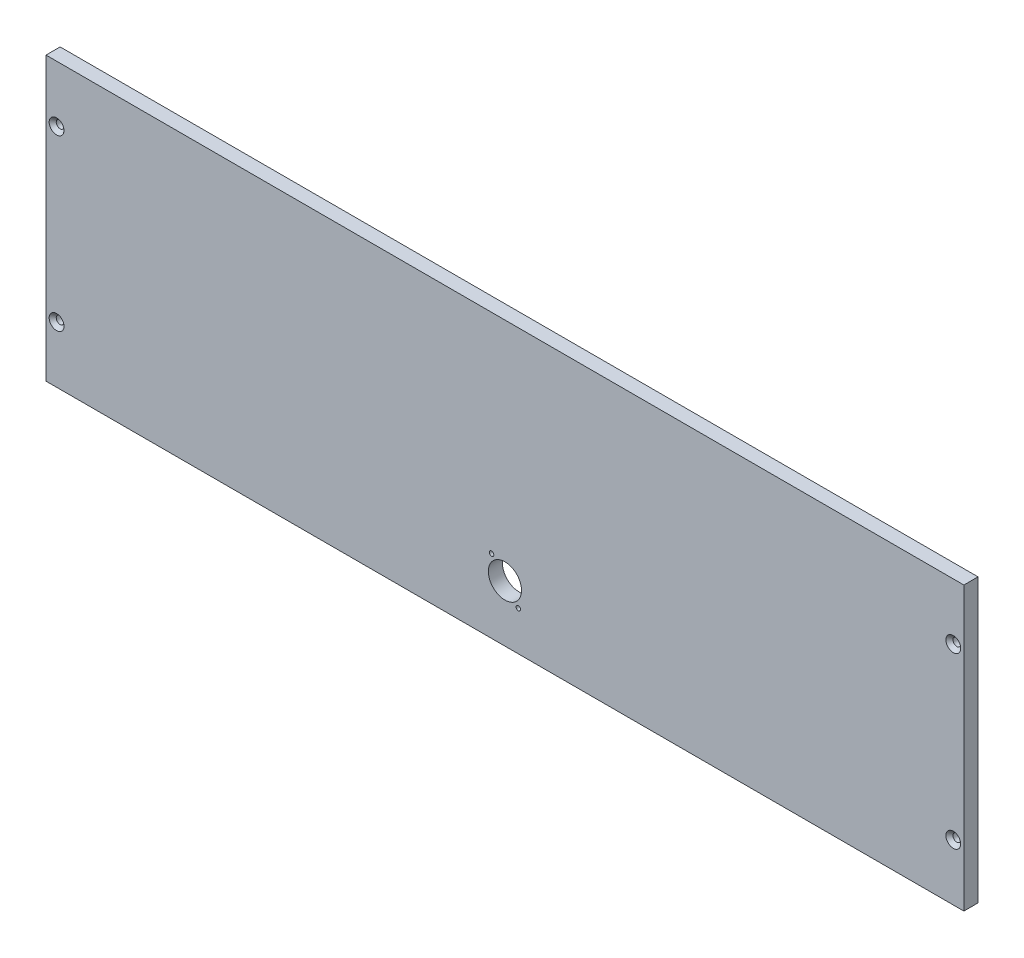
ISO-10303-21;
HEADER;
FILE_DESCRIPTION(('STEP AP214'),'2;1');
FILE_NAME('part.step','',(''),(''),'','','');
FILE_SCHEMA(('AUTOMOTIVE_DESIGN { 1 0 10303 214 1 1 1 1 }'));
ENDSEC;
DATA;
#1=APPLICATION_CONTEXT('core data for automotive mechanical design processes');
#2=APPLICATION_PROTOCOL_DEFINITION('international standard','automotive_design',2000,#1);
#3=PRODUCT_CONTEXT('',#1,'mechanical');
#4=PRODUCT('Part','Part','',(#3));
#5=PRODUCT_RELATED_PRODUCT_CATEGORY('part','',(#4));
#6=PRODUCT_DEFINITION_FORMATION('','',#4);
#7=PRODUCT_DEFINITION_CONTEXT('part definition',#1,'design');
#8=PRODUCT_DEFINITION('design','',#6,#7);
#9=PRODUCT_DEFINITION_SHAPE('','',#8);
#10=(LENGTH_UNIT() NAMED_UNIT(*) SI_UNIT(.MILLI.,.METRE.));
#11=(NAMED_UNIT(*) PLANE_ANGLE_UNIT() SI_UNIT($,.RADIAN.));
#12=(NAMED_UNIT(*) SI_UNIT($,.STERADIAN.) SOLID_ANGLE_UNIT());
#13=UNCERTAINTY_MEASURE_WITH_UNIT(LENGTH_MEASURE(1.E-05),#10,'distance_accuracy_value','');
#14=(GEOMETRIC_REPRESENTATION_CONTEXT(3) GLOBAL_UNCERTAINTY_ASSIGNED_CONTEXT((#13)) GLOBAL_UNIT_ASSIGNED_CONTEXT((#10,
#11,#12)) REPRESENTATION_CONTEXT('',''));
#15=CARTESIAN_POINT('',(0.,0.,0.));
#16=DIRECTION('',(0.,0.,1.));
#17=DIRECTION('',(1.,0.,0.));
#18=AXIS2_PLACEMENT_3D('',#15,#16,#17);
#19=CARTESIAN_POINT('',(0.,0.,10.));
#20=DIRECTION('',(1.,0.,0.));
#21=DIRECTION('',(0.,0.,-1.));
#22=AXIS2_PLACEMENT_3D('',#19,#20,#21);
#23=PLANE('',#22);
#24=DIRECTION('',(0.,-1.,0.));
#25=VECTOR('',#24,1.);
#26=CARTESIAN_POINT('',(0.,0.,0.));
#27=LINE('',#26,#25);
#28=CARTESIAN_POINT('',(0.,200.,0.));
#29=VERTEX_POINT('',#28);
#30=CARTESIAN_POINT('',(0.,0.,0.));
#31=VERTEX_POINT('',#30);
#32=EDGE_CURVE('E114',#29,#31,#27,.T.);
#33=ORIENTED_EDGE('',*,*,#32,.T.);
#34=DIRECTION('',(0.,0.,-1.));
#35=VECTOR('',#34,1.);
#36=CARTESIAN_POINT('',(0.,0.,10.));
#37=LINE('',#36,#35);
#38=CARTESIAN_POINT('',(0.,0.,10.));
#39=VERTEX_POINT('',#38);
#40=EDGE_CURVE('E105',#39,#31,#37,.T.);
#41=ORIENTED_EDGE('',*,*,#40,.F.);
#42=DIRECTION('',(0.,-1.,0.));
#43=VECTOR('',#42,1.);
#44=CARTESIAN_POINT('',(0.,0.,10.));
#45=LINE('',#44,#43);
#46=CARTESIAN_POINT('',(0.,200.,10.));
#47=VERTEX_POINT('',#46);
#48=EDGE_CURVE('E99',#47,#39,#45,.T.);
#49=ORIENTED_EDGE('',*,*,#48,.F.);
#50=DIRECTION('',(0.,0.,-1.));
#51=VECTOR('',#50,1.);
#52=CARTESIAN_POINT('',(0.,200.,10.));
#53=LINE('',#52,#51);
#54=EDGE_CURVE('E110',#47,#29,#53,.T.);
#55=ORIENTED_EDGE('',*,*,#54,.T.);
#56=EDGE_LOOP('',(#33,#41,#49,#55));
#57=FACE_BOUND('',#56,.T.);
#58=ADVANCED_FACE('F46',(#57),#23,.F.);
#59=CARTESIAN_POINT('',(0.,0.,10.));
#60=DIRECTION('',(0.,1.,0.));
#61=DIRECTION('',(0.,0.,1.));
#62=AXIS2_PLACEMENT_3D('',#59,#60,#61);
#63=PLANE('',#62);
#64=DIRECTION('',(1.,0.,0.));
#65=VECTOR('',#64,1.);
#66=CARTESIAN_POINT('',(0.,0.,0.));
#67=LINE('',#66,#65);
#68=CARTESIAN_POINT('',(650.,0.,0.));
#69=VERTEX_POINT('',#68);
#70=EDGE_CURVE('E104',#31,#69,#67,.T.);
#71=ORIENTED_EDGE('',*,*,#70,.T.);
#72=DIRECTION('',(0.,0.,-1.));
#73=VECTOR('',#72,1.);
#74=CARTESIAN_POINT('',(650.,0.,10.));
#75=LINE('',#74,#73);
#76=CARTESIAN_POINT('',(650.,0.,10.));
#77=VERTEX_POINT('',#76);
#78=EDGE_CURVE('E102',#77,#69,#75,.T.);
#79=ORIENTED_EDGE('',*,*,#78,.F.);
#80=DIRECTION('',(1.,0.,0.));
#81=VECTOR('',#80,1.);
#82=CARTESIAN_POINT('',(0.,0.,10.));
#83=LINE('',#82,#81);
#84=EDGE_CURVE('E94',#39,#77,#83,.T.);
#85=ORIENTED_EDGE('',*,*,#84,.F.);
#86=ORIENTED_EDGE('',*,*,#40,.T.);
#87=EDGE_LOOP('',(#71,#79,#85,#86));
#88=FACE_BOUND('',#87,.T.);
#89=ADVANCED_FACE('F103',(#88),#63,.F.);
#90=CARTESIAN_POINT('',(650.,0.,10.));
#91=DIRECTION('',(-1.,0.,0.));
#92=DIRECTION('',(0.,0.,1.));
#93=AXIS2_PLACEMENT_3D('',#90,#91,#92);
#94=PLANE('',#93);
#95=DIRECTION('',(0.,1.,0.));
#96=VECTOR('',#95,1.);
#97=CARTESIAN_POINT('',(650.,0.,0.));
#98=LINE('',#97,#96);
#99=CARTESIAN_POINT('',(650.,200.,0.));
#100=VERTEX_POINT('',#99);
#101=EDGE_CURVE('E80',#69,#100,#98,.T.);
#102=ORIENTED_EDGE('',*,*,#101,.T.);
#103=DIRECTION('',(0.,0.,-1.));
#104=VECTOR('',#103,1.);
#105=CARTESIAN_POINT('',(650.,200.,10.));
#106=LINE('',#105,#104);
#107=CARTESIAN_POINT('',(650.,200.,10.));
#108=VERTEX_POINT('',#107);
#109=EDGE_CURVE('E106',#108,#100,#106,.T.);
#110=ORIENTED_EDGE('',*,*,#109,.F.);
#111=DIRECTION('',(0.,1.,0.));
#112=VECTOR('',#111,1.);
#113=CARTESIAN_POINT('',(650.,0.,10.));
#114=LINE('',#113,#112);
#115=EDGE_CURVE('E97',#77,#108,#114,.T.);
#116=ORIENTED_EDGE('',*,*,#115,.F.);
#117=ORIENTED_EDGE('',*,*,#78,.T.);
#118=EDGE_LOOP('',(#102,#110,#116,#117));
#119=FACE_BOUND('',#118,.T.);
#120=ADVANCED_FACE('F108',(#119),#94,.F.);
#121=CARTESIAN_POINT('',(0.,200.,10.));
#122=DIRECTION('',(0.,-1.,0.));
#123=DIRECTION('',(0.,0.,-1.));
#124=AXIS2_PLACEMENT_3D('',#121,#122,#123);
#125=PLANE('',#124);
#126=DIRECTION('',(-1.,0.,0.));
#127=VECTOR('',#126,1.);
#128=CARTESIAN_POINT('',(0.,200.,0.));
#129=LINE('',#128,#127);
#130=EDGE_CURVE('E86',#100,#29,#129,.T.);
#131=ORIENTED_EDGE('',*,*,#130,.T.);
#132=ORIENTED_EDGE('',*,*,#54,.F.);
#133=DIRECTION('',(-1.,0.,0.));
#134=VECTOR('',#133,1.);
#135=CARTESIAN_POINT('',(0.,200.,10.));
#136=LINE('',#135,#134);
#137=EDGE_CURVE('E63',#108,#47,#136,.T.);
#138=ORIENTED_EDGE('',*,*,#137,.F.);
#139=ORIENTED_EDGE('',*,*,#109,.T.);
#140=EDGE_LOOP('',(#131,#132,#138,#139));
#141=FACE_BOUND('',#140,.T.);
#142=ADVANCED_FACE('F232',(#141),#125,.F.);
#143=CARTESIAN_POINT('',(0.,0.,10.));
#144=DIRECTION('',(0.,0.,-1.));
#145=DIRECTION('',(-1.,0.,0.));
#146=AXIS2_PLACEMENT_3D('',#143,#144,#145);
#147=PLANE('',#146);
#148=CARTESIAN_POINT('',(315.499614793712,51.9994043990588,10.));
#149=DIRECTION('',(0.,0.,1.));
#150=DIRECTION('',(1.,0.,0.));
#151=AXIS2_PLACEMENT_3D('',#148,#149,#150);
#152=CIRCLE('',#151,1.59999999999995);
#153=CARTESIAN_POINT('',(317.099614793712,51.9994043990588,10.));
#154=VERTEX_POINT('',#153);
#155=EDGE_CURVE('E215',#154,#154,#152,.T.);
#156=ORIENTED_EDGE('',*,*,#155,.F.);
#157=EDGE_LOOP('',(#156));
#158=FACE_BOUND('',#157,.T.);
#159=CARTESIAN_POINT('',(334.500385206288,28.0005956009415,10.));
#160=DIRECTION('',(0.,0.,1.));
#161=DIRECTION('',(1.,0.,0.));
#162=AXIS2_PLACEMENT_3D('',#159,#160,#161);
#163=CIRCLE('',#162,1.59999999999977);
#164=CARTESIAN_POINT('',(336.100385206288,28.0005956009415,10.));
#165=VERTEX_POINT('',#164);
#166=EDGE_CURVE('E209',#165,#165,#163,.T.);
#167=ORIENTED_EDGE('',*,*,#166,.F.);
#168=EDGE_LOOP('',(#167));
#169=FACE_BOUND('',#168,.T.);
#170=CARTESIAN_POINT('',(325.,40.,10.));
#171=DIRECTION('',(0.,0.,1.));
#172=DIRECTION('',(1.,0.,0.));
#173=AXIS2_PLACEMENT_3D('',#170,#171,#172);
#174=CIRCLE('',#173,11.75);
#175=CARTESIAN_POINT('',(336.75,40.,10.));
#176=VERTEX_POINT('',#175);
#177=EDGE_CURVE('E203',#176,#176,#174,.T.);
#178=ORIENTED_EDGE('',*,*,#177,.F.);
#179=EDGE_LOOP('',(#178));
#180=FACE_BOUND('',#179,.T.);
#181=CARTESIAN_POINT('',(7.5,160.,10.));
#182=DIRECTION('',(0.,0.,-1.));
#183=DIRECTION('',(-1.,0.,0.));
#184=AXIS2_PLACEMENT_3D('',#181,#182,#183);
#185=CIRCLE('',#184,5.25000000000003);
#186=CARTESIAN_POINT('',(2.24999999999997,160.,10.));
#187=VERTEX_POINT('',#186);
#188=EDGE_CURVE('E136',#187,#187,#185,.T.);
#189=ORIENTED_EDGE('',*,*,#188,.T.);
#190=EDGE_LOOP('',(#189));
#191=FACE_BOUND('',#190,.T.);
#192=CARTESIAN_POINT('',(7.5,40.,10.));
#193=DIRECTION('',(0.,0.,-1.));
#194=DIRECTION('',(-1.,0.,0.));
#195=AXIS2_PLACEMENT_3D('',#192,#193,#194);
#196=CIRCLE('',#195,5.25000000000003);
#197=CARTESIAN_POINT('',(2.24999999999997,40.,10.));
#198=VERTEX_POINT('',#197);
#199=EDGE_CURVE('E133',#198,#198,#196,.T.);
#200=ORIENTED_EDGE('',*,*,#199,.T.);
#201=EDGE_LOOP('',(#200));
#202=FACE_BOUND('',#201,.T.);
#203=CARTESIAN_POINT('',(642.5,40.,10.));
#204=DIRECTION('',(0.,0.,-1.));
#205=DIRECTION('',(-1.,0.,0.));
#206=AXIS2_PLACEMENT_3D('',#203,#204,#205);
#207=CIRCLE('',#206,5.24999999999998);
#208=CARTESIAN_POINT('',(647.75,40.,10.));
#209=VERTEX_POINT('',#208);
#210=EDGE_CURVE('E130',#209,#209,#207,.T.);
#211=ORIENTED_EDGE('',*,*,#210,.T.);
#212=EDGE_LOOP('',(#211));
#213=FACE_BOUND('',#212,.T.);
#214=CARTESIAN_POINT('',(642.5,160.,10.));
#215=DIRECTION('',(0.,0.,-1.));
#216=DIRECTION('',(-1.,0.,0.));
#217=AXIS2_PLACEMENT_3D('',#214,#215,#216);
#218=CIRCLE('',#217,5.24999999999998);
#219=CARTESIAN_POINT('',(637.25,160.,10.));
#220=VERTEX_POINT('',#219);
#221=EDGE_CURVE('E127',#220,#220,#218,.T.);
#222=ORIENTED_EDGE('',*,*,#221,.T.);
#223=EDGE_LOOP('',(#222));
#224=FACE_BOUND('',#223,.T.);
#225=ORIENTED_EDGE('',*,*,#48,.T.);
#226=ORIENTED_EDGE('',*,*,#84,.T.);
#227=ORIENTED_EDGE('',*,*,#115,.T.);
#228=ORIENTED_EDGE('',*,*,#137,.T.);
#229=EDGE_LOOP('',(#225,#226,#227,#228));
#230=FACE_BOUND('',#229,.T.);
#231=ADVANCED_FACE('F95',(#158,#169,#180,#191,#202,#213,#224,#230),#147,.F.);
#232=CARTESIAN_POINT('',(0.,0.,0.));
#233=DIRECTION('',(0.,0.,-1.));
#234=DIRECTION('',(-1.,0.,0.));
#235=AXIS2_PLACEMENT_3D('',#232,#233,#234);
#236=PLANE('',#235);
#237=CARTESIAN_POINT('',(315.499614793712,51.9994043990588,0.));
#238=DIRECTION('',(0.,0.,1.));
#239=DIRECTION('',(1.,0.,0.));
#240=AXIS2_PLACEMENT_3D('',#237,#238,#239);
#241=CIRCLE('',#240,1.59999999999995);
#242=CARTESIAN_POINT('',(317.099614793712,51.9994043990588,0.));
#243=VERTEX_POINT('',#242);
#244=EDGE_CURVE('E206',#243,#243,#241,.T.);
#245=ORIENTED_EDGE('',*,*,#244,.T.);
#246=EDGE_LOOP('',(#245));
#247=FACE_BOUND('',#246,.T.);
#248=CARTESIAN_POINT('',(334.500385206288,28.0005956009415,0.));
#249=DIRECTION('',(0.,0.,1.));
#250=DIRECTION('',(1.,0.,0.));
#251=AXIS2_PLACEMENT_3D('',#248,#249,#250);
#252=CIRCLE('',#251,1.59999999999977);
#253=CARTESIAN_POINT('',(336.100385206288,28.0005956009415,0.));
#254=VERTEX_POINT('',#253);
#255=EDGE_CURVE('E212',#254,#254,#252,.T.);
#256=ORIENTED_EDGE('',*,*,#255,.T.);
#257=EDGE_LOOP('',(#256));
#258=FACE_BOUND('',#257,.T.);
#259=CARTESIAN_POINT('',(325.,40.,0.));
#260=DIRECTION('',(0.,0.,1.));
#261=DIRECTION('',(1.,0.,0.));
#262=AXIS2_PLACEMENT_3D('',#259,#260,#261);
#263=CIRCLE('',#262,11.75);
#264=CARTESIAN_POINT('',(336.75,40.,0.));
#265=VERTEX_POINT('',#264);
#266=EDGE_CURVE('E200',#265,#265,#263,.T.);
#267=ORIENTED_EDGE('',*,*,#266,.T.);
#268=EDGE_LOOP('',(#267));
#269=FACE_BOUND('',#268,.T.);
#270=CARTESIAN_POINT('',(642.5,160.,0.));
#271=DIRECTION('',(0.,0.,1.));
#272=DIRECTION('',(1.,0.,0.));
#273=AXIS2_PLACEMENT_3D('',#270,#271,#272);
#274=CIRCLE('',#273,2.75000000000004);
#275=CARTESIAN_POINT('',(645.25,160.,0.));
#276=VERTEX_POINT('',#275);
#277=EDGE_CURVE('E191',#276,#276,#274,.T.);
#278=ORIENTED_EDGE('',*,*,#277,.T.);
#279=EDGE_LOOP('',(#278));
#280=FACE_BOUND('',#279,.T.);
#281=CARTESIAN_POINT('',(7.5,40.,0.));
#282=DIRECTION('',(0.,0.,1.));
#283=DIRECTION('',(1.,0.,0.));
#284=AXIS2_PLACEMENT_3D('',#281,#282,#283);
#285=CIRCLE('',#284,2.75);
#286=CARTESIAN_POINT('',(10.25,40.,0.));
#287=VERTEX_POINT('',#286);
#288=EDGE_CURVE('E194',#287,#287,#285,.T.);
#289=ORIENTED_EDGE('',*,*,#288,.T.);
#290=EDGE_LOOP('',(#289));
#291=FACE_BOUND('',#290,.T.);
#292=CARTESIAN_POINT('',(642.5,40.,0.));
#293=DIRECTION('',(0.,0.,1.));
#294=DIRECTION('',(1.,0.,0.));
#295=AXIS2_PLACEMENT_3D('',#292,#293,#294);
#296=CIRCLE('',#295,2.75000000000004);
#297=CARTESIAN_POINT('',(645.25,40.,0.));
#298=VERTEX_POINT('',#297);
#299=EDGE_CURVE('E197',#298,#298,#296,.T.);
#300=ORIENTED_EDGE('',*,*,#299,.T.);
#301=EDGE_LOOP('',(#300));
#302=FACE_BOUND('',#301,.T.);
#303=CARTESIAN_POINT('',(7.5,160.,0.));
#304=DIRECTION('',(0.,0.,1.));
#305=DIRECTION('',(1.,0.,0.));
#306=AXIS2_PLACEMENT_3D('',#303,#304,#305);
#307=CIRCLE('',#306,2.75);
#308=CARTESIAN_POINT('',(10.25,160.,0.));
#309=VERTEX_POINT('',#308);
#310=EDGE_CURVE('E117',#309,#309,#307,.T.);
#311=ORIENTED_EDGE('',*,*,#310,.T.);
#312=EDGE_LOOP('',(#311));
#313=FACE_BOUND('',#312,.T.);
#314=ORIENTED_EDGE('',*,*,#32,.F.);
#315=ORIENTED_EDGE('',*,*,#130,.F.);
#316=ORIENTED_EDGE('',*,*,#101,.F.);
#317=ORIENTED_EDGE('',*,*,#70,.F.);
#318=EDGE_LOOP('',(#314,#315,#316,#317));
#319=FACE_BOUND('',#318,.T.);
#320=ADVANCED_FACE('F186',(#247,#258,#269,#280,#291,#302,#313,#319),#236,.T.);
#321=CARTESIAN_POINT('',(7.5,160.,0.));
#322=DIRECTION('',(0.,0.,1.));
#323=DIRECTION('',(1.,0.,0.));
#324=AXIS2_PLACEMENT_3D('',#321,#322,#323);
#325=CYLINDRICAL_SURFACE('',#324,2.75);
#326=CARTESIAN_POINT('',(7.5,160.,7.49999999999996));
#327=DIRECTION('',(0.,0.,-1.));
#328=DIRECTION('',(-1.,0.,0.));
#329=AXIS2_PLACEMENT_3D('',#326,#327,#328);
#330=CIRCLE('',#329,2.75);
#331=CARTESIAN_POINT('',(4.75,160.,7.49999999999996));
#332=VERTEX_POINT('',#331);
#333=EDGE_CURVE('E124',#332,#332,#330,.F.);
#334=ORIENTED_EDGE('',*,*,#333,.T.);
#335=EDGE_LOOP('',(#334));
#336=FACE_BOUND('',#335,.T.);
#337=ORIENTED_EDGE('',*,*,#310,.F.);
#338=EDGE_LOOP('',(#337));
#339=FACE_BOUND('',#338,.T.);
#340=ADVANCED_FACE('F183',(#336,#339),#325,.F.);
#341=CARTESIAN_POINT('',(642.5,40.,0.));
#342=DIRECTION('',(0.,0.,1.));
#343=DIRECTION('',(1.,0.,0.));
#344=AXIS2_PLACEMENT_3D('',#341,#342,#343);
#345=CYLINDRICAL_SURFACE('',#344,2.75000000000004);
#346=CARTESIAN_POINT('',(642.5,40.,7.5));
#347=DIRECTION('',(0.,0.,-1.));
#348=DIRECTION('',(-1.,0.,0.));
#349=AXIS2_PLACEMENT_3D('',#346,#347,#348);
#350=CIRCLE('',#349,2.75000000000004);
#351=CARTESIAN_POINT('',(645.25,40.,7.5));
#352=VERTEX_POINT('',#351);
#353=EDGE_CURVE('E55',#352,#352,#350,.F.);
#354=ORIENTED_EDGE('',*,*,#353,.T.);
#355=EDGE_LOOP('',(#354));
#356=FACE_BOUND('',#355,.T.);
#357=ORIENTED_EDGE('',*,*,#299,.F.);
#358=EDGE_LOOP('',(#357));
#359=FACE_BOUND('',#358,.T.);
#360=ADVANCED_FACE('F144',(#356,#359),#345,.F.);
#361=CARTESIAN_POINT('',(7.5,40.,0.));
#362=DIRECTION('',(0.,0.,1.));
#363=DIRECTION('',(1.,0.,0.));
#364=AXIS2_PLACEMENT_3D('',#361,#362,#363);
#365=CYLINDRICAL_SURFACE('',#364,2.75);
#366=CARTESIAN_POINT('',(7.5,40.,7.49999999999996));
#367=DIRECTION('',(0.,0.,-1.));
#368=DIRECTION('',(-1.,0.,0.));
#369=AXIS2_PLACEMENT_3D('',#366,#367,#368);
#370=CIRCLE('',#369,2.75);
#371=CARTESIAN_POINT('',(4.75,40.,7.49999999999996));
#372=VERTEX_POINT('',#371);
#373=EDGE_CURVE('E139',#372,#372,#370,.F.);
#374=ORIENTED_EDGE('',*,*,#373,.T.);
#375=EDGE_LOOP('',(#374));
#376=FACE_BOUND('',#375,.T.);
#377=ORIENTED_EDGE('',*,*,#288,.F.);
#378=EDGE_LOOP('',(#377));
#379=FACE_BOUND('',#378,.T.);
#380=ADVANCED_FACE('F176',(#376,#379),#365,.F.);
#381=CARTESIAN_POINT('',(642.5,160.,0.));
#382=DIRECTION('',(0.,0.,1.));
#383=DIRECTION('',(1.,0.,0.));
#384=AXIS2_PLACEMENT_3D('',#381,#382,#383);
#385=CYLINDRICAL_SURFACE('',#384,2.75000000000004);
#386=CARTESIAN_POINT('',(642.5,160.,7.49999999999999));
#387=DIRECTION('',(0.,0.,-1.));
#388=DIRECTION('',(-1.,0.,0.));
#389=AXIS2_PLACEMENT_3D('',#386,#387,#388);
#390=CIRCLE('',#389,2.75000000000004);
#391=CARTESIAN_POINT('',(639.75,160.,7.49999999999999));
#392=VERTEX_POINT('',#391);
#393=EDGE_CURVE('E12',#392,#392,#390,.F.);
#394=ORIENTED_EDGE('',*,*,#393,.T.);
#395=EDGE_LOOP('',(#394));
#396=FACE_BOUND('',#395,.T.);
#397=ORIENTED_EDGE('',*,*,#277,.F.);
#398=EDGE_LOOP('',(#397));
#399=FACE_BOUND('',#398,.T.);
#400=ADVANCED_FACE('F171',(#396,#399),#385,.F.);
#401=CARTESIAN_POINT('',(7.5,160.,7.49999999999996));
#402=DIRECTION('',(0.,0.,1.));
#403=DIRECTION('',(1.,0.,0.));
#404=AXIS2_PLACEMENT_3D('',#401,#402,#403);
#405=CONICAL_SURFACE('',#404,2.75,0.785398163397446);
#406=ORIENTED_EDGE('',*,*,#188,.F.);
#407=EDGE_LOOP('',(#406));
#408=FACE_BOUND('',#407,.T.);
#409=ORIENTED_EDGE('',*,*,#333,.F.);
#410=EDGE_LOOP('',(#409));
#411=FACE_BOUND('',#410,.T.);
#412=ADVANCED_FACE('F157',(#408,#411),#405,.F.);
#413=CARTESIAN_POINT('',(7.5,40.,7.49999999999996));
#414=DIRECTION('',(0.,0.,1.));
#415=DIRECTION('',(1.,0.,0.));
#416=AXIS2_PLACEMENT_3D('',#413,#414,#415);
#417=CONICAL_SURFACE('',#416,2.75,0.785398163397446);
#418=ORIENTED_EDGE('',*,*,#199,.F.);
#419=EDGE_LOOP('',(#418));
#420=FACE_BOUND('',#419,.T.);
#421=ORIENTED_EDGE('',*,*,#373,.F.);
#422=EDGE_LOOP('',(#421));
#423=FACE_BOUND('',#422,.T.);
#424=ADVANCED_FACE('F149',(#420,#423),#417,.F.);
#425=CARTESIAN_POINT('',(642.5,40.,7.5));
#426=DIRECTION('',(0.,0.,1.));
#427=DIRECTION('',(1.,0.,0.));
#428=AXIS2_PLACEMENT_3D('',#425,#426,#427);
#429=CONICAL_SURFACE('',#428,2.75000000000004,0.785398163397435);
#430=CARTESIAN_POINT('',(647.75,40.,10.));
#431=CARTESIAN_POINT('',(647.723958333333,40.,9.97395833333336));
#432=CARTESIAN_POINT('',(647.697916666667,40.,9.94791666666669));
#433=CARTESIAN_POINT('',(647.645833333333,40.,9.89583333333333));
#434=CARTESIAN_POINT('',(647.619791666667,40.,9.86979166666666));
#435=CARTESIAN_POINT('',(647.567708333333,40.,9.81770833333333));
#436=CARTESIAN_POINT('',(647.541666666667,40.,9.79166666666668));
#437=CARTESIAN_POINT('',(647.489583333333,40.,9.73958333333334));
#438=CARTESIAN_POINT('',(647.463541666667,40.,9.71354166666666));
#439=CARTESIAN_POINT('',(647.411458333333,40.,9.66145833333332));
#440=CARTESIAN_POINT('',(647.385416666667,40.,9.63541666666666));
#441=CARTESIAN_POINT('',(647.333333333333,40.,9.58333333333334));
#442=CARTESIAN_POINT('',(647.307291666667,40.,9.55729166666668));
#443=CARTESIAN_POINT('',(647.255208333333,40.,9.50520833333334));
#444=CARTESIAN_POINT('',(647.229166666667,40.,9.47916666666666));
#445=CARTESIAN_POINT('',(647.177083333333,40.,9.42708333333332));
#446=CARTESIAN_POINT('',(647.151041666667,40.,9.40104166666666));
#447=CARTESIAN_POINT('',(647.098958333333,40.,9.34895833333334));
#448=CARTESIAN_POINT('',(647.072916666667,40.,9.32291666666668));
#449=CARTESIAN_POINT('',(647.020833333333,40.,9.27083333333334));
#450=CARTESIAN_POINT('',(646.994791666667,40.,9.24479166666666));
#451=CARTESIAN_POINT('',(646.942708333333,40.,9.19270833333332));
#452=CARTESIAN_POINT('',(646.916666666667,40.,9.16666666666667));
#453=CARTESIAN_POINT('',(646.864583333333,40.,9.11458333333334));
#454=CARTESIAN_POINT('',(646.838541666667,40.,9.08854166666666));
#455=CARTESIAN_POINT('',(646.786458333333,40.,9.03645833333332));
#456=CARTESIAN_POINT('',(646.760416666667,40.,9.01041666666666));
#457=CARTESIAN_POINT('',(646.708333333333,40.,8.95833333333334));
#458=CARTESIAN_POINT('',(646.682291666667,40.,8.93229166666668));
#459=CARTESIAN_POINT('',(646.630208333333,40.,8.88020833333334));
#460=CARTESIAN_POINT('',(646.604166666667,40.,8.85416666666666));
#461=CARTESIAN_POINT('',(646.552083333333,40.,8.80208333333332));
#462=CARTESIAN_POINT('',(646.526041666667,40.,8.77604166666666));
#463=CARTESIAN_POINT('',(646.473958333333,40.,8.72395833333334));
#464=CARTESIAN_POINT('',(646.447916666667,40.,8.69791666666668));
#465=CARTESIAN_POINT('',(646.395833333333,40.,8.64583333333334));
#466=CARTESIAN_POINT('',(646.369791666667,40.,8.61979166666665));
#467=CARTESIAN_POINT('',(646.317708333333,40.,8.56770833333332));
#468=CARTESIAN_POINT('',(646.291666666667,40.,8.54166666666667));
#469=CARTESIAN_POINT('',(646.239583333333,40.,8.48958333333334));
#470=CARTESIAN_POINT('',(646.213541666667,40.,8.46354166666666));
#471=CARTESIAN_POINT('',(646.161458333333,40.,8.41145833333332));
#472=CARTESIAN_POINT('',(646.135416666667,40.,8.38541666666666));
#473=CARTESIAN_POINT('',(646.083333333333,40.,8.33333333333334));
#474=CARTESIAN_POINT('',(646.057291666667,40.,8.30729166666668));
#475=CARTESIAN_POINT('',(646.005208333333,40.,8.25520833333334));
#476=CARTESIAN_POINT('',(645.979166666667,40.,8.22916666666666));
#477=CARTESIAN_POINT('',(645.927083333333,40.,8.17708333333332));
#478=CARTESIAN_POINT('',(645.901041666667,40.,8.15104166666666));
#479=CARTESIAN_POINT('',(645.848958333333,40.,8.09895833333334));
#480=CARTESIAN_POINT('',(645.822916666667,40.,8.07291666666668));
#481=CARTESIAN_POINT('',(645.770833333333,40.,8.02083333333333));
#482=CARTESIAN_POINT('',(645.744791666667,40.,7.99479166666665));
#483=CARTESIAN_POINT('',(645.692708333333,40.,7.94270833333332));
#484=CARTESIAN_POINT('',(645.666666666667,40.,7.91666666666667));
#485=CARTESIAN_POINT('',(645.614583333333,40.,7.86458333333334));
#486=CARTESIAN_POINT('',(645.588541666667,40.,7.83854166666666));
#487=CARTESIAN_POINT('',(645.536458333333,40.,7.78645833333332));
#488=CARTESIAN_POINT('',(645.510416666667,40.,7.76041666666666));
#489=CARTESIAN_POINT('',(645.458333333333,40.,7.70833333333334));
#490=CARTESIAN_POINT('',(645.432291666667,40.,7.68229166666667));
#491=CARTESIAN_POINT('',(645.380208333333,40.,7.63020833333334));
#492=CARTESIAN_POINT('',(645.354166666667,40.,7.60416666666666));
#493=CARTESIAN_POINT('',(645.302083333333,40.,7.55208333333331));
#494=CARTESIAN_POINT('',(645.276041666667,40.,7.52604166666664));
#495=CARTESIAN_POINT('',(645.25,40.,7.5));
#496=B_SPLINE_CURVE_WITH_KNOTS('',3,(#430,#431,#432,#433,#434,#435,#436,#437,#438,#439,#440,
#441,#442,#443,#444,#445,#446,#447,#448,#449,#450,#451,#452,#453,#454,#455,#456,#457,#458,#459,
#460,#461,#462,#463,#464,#465,#466,#467,#468,#469,#470,#471,#472,#473,#474,#475,#476,#477,#478,
#479,#480,#481,#482,#483,#484,#485,#486,#487,#488,#489,#490,#491,#492,#493,#494,#495),
.UNSPECIFIED.,.F.,.F.,(4,2,2,2,2,2,2,2,2,2,2,2,2,2,2,2,2,2,2,2,2,2,2,2,2,2,2,2,2,2,2,2,4),(0.,
0.110485434560426,0.220970869120774,0.331456303681201,0.441941738241548,0.552427172801975,
0.662912607362401,0.773398041922749,0.883883476483175,0.994368911043602,1.10485434560395,
1.21533978016438,1.32582521472472,1.43631064928515,1.54679608384558,1.65728151840592,
1.76776695296635,1.87825238752678,1.98873782208713,2.09922325664755,2.2097086912079,
2.32019412576833,2.43067956032875,2.5411649948891,2.65165042944953,2.76213586400995,
2.8726212985703,2.98310673313073,3.09359216769107,3.2040776022515,3.31456303681193,
3.42504847137228,3.5355339059327),.UNSPECIFIED.);
#497=EDGE_CURVE('BSEAM147',#209,#352,#496,.T.);
#498=ORIENTED_EDGE('',*,*,#210,.F.);
#499=ORIENTED_EDGE('',*,*,#353,.F.);
#500=ORIENTED_EDGE('',*,*,#497,.T.);
#501=ORIENTED_EDGE('',*,*,#497,.F.);
#502=EDGE_LOOP('',(#498,#500,#499,#501));
#503=FACE_BOUND('',#502,.T.);
#504=ADVANCED_FACE('F147',(#503),#429,.F.);
#505=CARTESIAN_POINT('',(642.5,160.,7.49999999999999));
#506=DIRECTION('',(0.,0.,1.));
#507=DIRECTION('',(1.,0.,0.));
#508=AXIS2_PLACEMENT_3D('',#505,#506,#507);
#509=CONICAL_SURFACE('',#508,2.75000000000004,0.785398163397435);
#510=ORIENTED_EDGE('',*,*,#221,.F.);
#511=EDGE_LOOP('',(#510));
#512=FACE_BOUND('',#511,.T.);
#513=ORIENTED_EDGE('',*,*,#393,.F.);
#514=EDGE_LOOP('',(#513));
#515=FACE_BOUND('',#514,.T.);
#516=ADVANCED_FACE('F48',(#512,#515),#509,.F.);
#517=CARTESIAN_POINT('',(325.,40.,0.));
#518=DIRECTION('',(0.,0.,1.));
#519=DIRECTION('',(1.,0.,0.));
#520=AXIS2_PLACEMENT_3D('',#517,#518,#519);
#521=CYLINDRICAL_SURFACE('',#520,11.75);
#522=ORIENTED_EDGE('',*,*,#266,.F.);
#523=EDGE_LOOP('',(#522));
#524=FACE_BOUND('',#523,.T.);
#525=ORIENTED_EDGE('',*,*,#177,.T.);
#526=EDGE_LOOP('',(#525));
#527=FACE_BOUND('',#526,.T.);
#528=ADVANCED_FACE('F155',(#524,#527),#521,.F.);
#529=CARTESIAN_POINT('',(334.500385206288,28.0005956009415,0.));
#530=DIRECTION('',(0.,0.,1.));
#531=DIRECTION('',(1.,0.,0.));
#532=AXIS2_PLACEMENT_3D('',#529,#530,#531);
#533=CYLINDRICAL_SURFACE('',#532,1.59999999999977);
#534=ORIENTED_EDGE('',*,*,#255,.F.);
#535=EDGE_LOOP('',(#534));
#536=FACE_BOUND('',#535,.T.);
#537=ORIENTED_EDGE('',*,*,#166,.T.);
#538=EDGE_LOOP('',(#537));
#539=FACE_BOUND('',#538,.T.);
#540=ADVANCED_FACE('F226',(#536,#539),#533,.F.);
#541=CARTESIAN_POINT('',(315.499614793712,51.9994043990588,0.));
#542=DIRECTION('',(0.,0.,1.));
#543=DIRECTION('',(1.,0.,0.));
#544=AXIS2_PLACEMENT_3D('',#541,#542,#543);
#545=CYLINDRICAL_SURFACE('',#544,1.59999999999995);
#546=ORIENTED_EDGE('',*,*,#244,.F.);
#547=EDGE_LOOP('',(#546));
#548=FACE_BOUND('',#547,.T.);
#549=ORIENTED_EDGE('',*,*,#155,.T.);
#550=EDGE_LOOP('',(#549));
#551=FACE_BOUND('',#550,.T.);
#552=ADVANCED_FACE('F223',(#548,#551),#545,.F.);
#553=CLOSED_SHELL('',(#58,#89,#120,#142,#231,#320,#340,#360,#380,#400,#412,#424,#504,#516,#528,
#540,#552));
#554=MANIFOLD_SOLID_BREP('B2',#553);
#555=ADVANCED_BREP_SHAPE_REPRESENTATION('',(#18,#554),#14);
#556=SHAPE_DEFINITION_REPRESENTATION(#9,#555);
ENDSEC;
END-ISO-10303-21;
